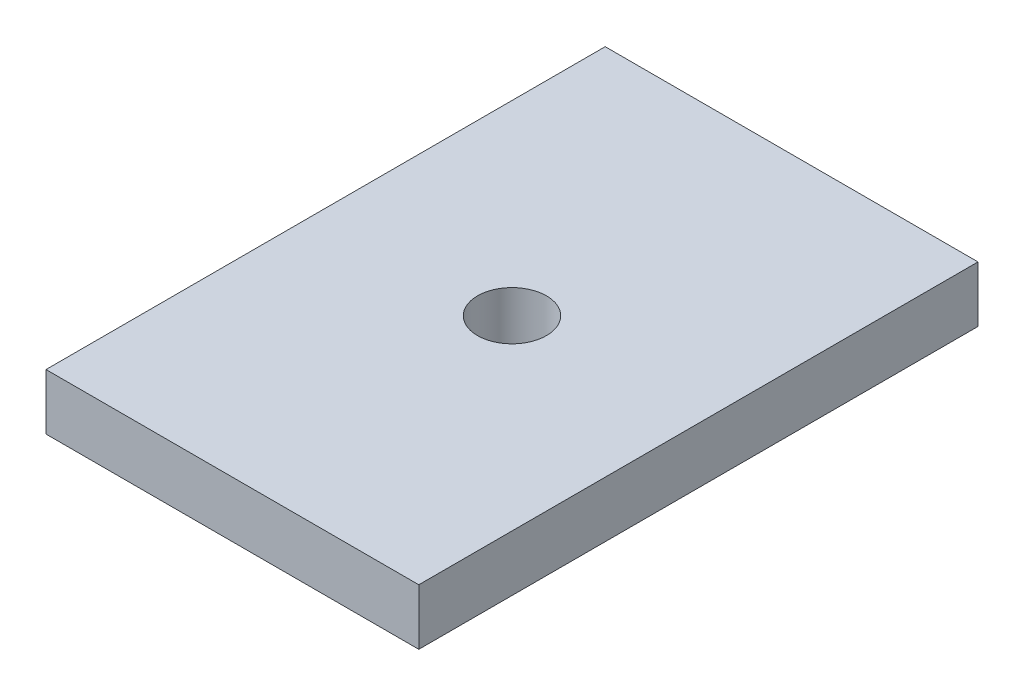
ISO-10303-21;
HEADER;
FILE_DESCRIPTION(('STEP AP214'),'2;1');
FILE_NAME('part.step','',(''),(''),'','','');
FILE_SCHEMA(('AUTOMOTIVE_DESIGN { 1 0 10303 214 1 1 1 1 }'));
ENDSEC;
DATA;
#1=APPLICATION_CONTEXT('core data for automotive mechanical design processes');
#2=APPLICATION_PROTOCOL_DEFINITION('international standard','automotive_design',2000,#1);
#3=PRODUCT_CONTEXT('',#1,'mechanical');
#4=PRODUCT('Part','Part','',(#3));
#5=PRODUCT_RELATED_PRODUCT_CATEGORY('part','',(#4));
#6=PRODUCT_DEFINITION_FORMATION('','',#4);
#7=PRODUCT_DEFINITION_CONTEXT('part definition',#1,'design');
#8=PRODUCT_DEFINITION('design','',#6,#7);
#9=PRODUCT_DEFINITION_SHAPE('','',#8);
#10=(LENGTH_UNIT() NAMED_UNIT(*) SI_UNIT(.MILLI.,.METRE.));
#11=(NAMED_UNIT(*) PLANE_ANGLE_UNIT() SI_UNIT($,.RADIAN.));
#12=(NAMED_UNIT(*) SI_UNIT($,.STERADIAN.) SOLID_ANGLE_UNIT());
#13=UNCERTAINTY_MEASURE_WITH_UNIT(LENGTH_MEASURE(1.E-05),#10,'distance_accuracy_value','');
#14=(GEOMETRIC_REPRESENTATION_CONTEXT(3) GLOBAL_UNCERTAINTY_ASSIGNED_CONTEXT((#13)) GLOBAL_UNIT_ASSIGNED_CONTEXT((#10,
#11,#12)) REPRESENTATION_CONTEXT('',''));
#15=CARTESIAN_POINT('',(0.,0.,0.));
#16=DIRECTION('',(0.,0.,1.));
#17=DIRECTION('',(1.,0.,0.));
#18=AXIS2_PLACEMENT_3D('',#15,#16,#17);
#19=CARTESIAN_POINT('',(-10.,3.,-15.));
#20=DIRECTION('',(1.,0.,0.));
#21=DIRECTION('',(0.,0.,-1.));
#22=AXIS2_PLACEMENT_3D('',#19,#20,#21);
#23=PLANE('',#22);
#24=DIRECTION('',(0.,0.,1.));
#25=VECTOR('',#24,1.);
#26=CARTESIAN_POINT('',(-10.,0.,-15.));
#27=LINE('',#26,#25);
#28=CARTESIAN_POINT('',(-10.,0.,-15.));
#29=VERTEX_POINT('',#28);
#30=CARTESIAN_POINT('',(-10.,0.,15.));
#31=VERTEX_POINT('',#30);
#32=EDGE_CURVE('E111',#29,#31,#27,.T.);
#33=ORIENTED_EDGE('',*,*,#32,.T.);
#34=DIRECTION('',(0.,-1.,0.));
#35=VECTOR('',#34,1.);
#36=CARTESIAN_POINT('',(-10.,3.,15.));
#37=LINE('',#36,#35);
#38=CARTESIAN_POINT('',(-10.,3.,15.));
#39=VERTEX_POINT('',#38);
#40=EDGE_CURVE('E11',#39,#31,#37,.T.);
#41=ORIENTED_EDGE('',*,*,#40,.F.);
#42=DIRECTION('',(0.,0.,1.));
#43=VECTOR('',#42,1.);
#44=CARTESIAN_POINT('',(-10.,3.,-15.));
#45=LINE('',#44,#43);
#46=CARTESIAN_POINT('',(-10.,3.,-15.));
#47=VERTEX_POINT('',#46);
#48=EDGE_CURVE('E93',#47,#39,#45,.T.);
#49=ORIENTED_EDGE('',*,*,#48,.F.);
#50=DIRECTION('',(0.,-1.,0.));
#51=VECTOR('',#50,1.);
#52=CARTESIAN_POINT('',(-10.,3.,-15.));
#53=LINE('',#52,#51);
#54=EDGE_CURVE('E60',#47,#29,#53,.T.);
#55=ORIENTED_EDGE('',*,*,#54,.T.);
#56=EDGE_LOOP('',(#33,#41,#49,#55));
#57=FACE_BOUND('',#56,.T.);
#58=ADVANCED_FACE('F43',(#57),#23,.F.);
#59=CARTESIAN_POINT('',(-10.,3.,15.));
#60=DIRECTION('',(0.,0.,-1.));
#61=DIRECTION('',(-1.,0.,0.));
#62=AXIS2_PLACEMENT_3D('',#59,#60,#61);
#63=PLANE('',#62);
#64=DIRECTION('',(1.,0.,0.));
#65=VECTOR('',#64,1.);
#66=CARTESIAN_POINT('',(-10.,0.,15.));
#67=LINE('',#66,#65);
#68=CARTESIAN_POINT('',(10.,0.,15.));
#69=VERTEX_POINT('',#68);
#70=EDGE_CURVE('E99',#31,#69,#67,.T.);
#71=ORIENTED_EDGE('',*,*,#70,.T.);
#72=DIRECTION('',(0.,-1.,0.));
#73=VECTOR('',#72,1.);
#74=CARTESIAN_POINT('',(10.,3.,15.));
#75=LINE('',#74,#73);
#76=CARTESIAN_POINT('',(10.,3.,15.));
#77=VERTEX_POINT('',#76);
#78=EDGE_CURVE('E52',#77,#69,#75,.T.);
#79=ORIENTED_EDGE('',*,*,#78,.F.);
#80=DIRECTION('',(1.,0.,0.));
#81=VECTOR('',#80,1.);
#82=CARTESIAN_POINT('',(-10.,3.,15.));
#83=LINE('',#82,#81);
#84=EDGE_CURVE('E85',#39,#77,#83,.T.);
#85=ORIENTED_EDGE('',*,*,#84,.F.);
#86=ORIENTED_EDGE('',*,*,#40,.T.);
#87=EDGE_LOOP('',(#71,#79,#85,#86));
#88=FACE_BOUND('',#87,.T.);
#89=ADVANCED_FACE('F98',(#88),#63,.F.);
#90=CARTESIAN_POINT('',(10.,3.,-15.));
#91=DIRECTION('',(1.,0.,0.));
#92=DIRECTION('',(0.,0.,-1.));
#93=AXIS2_PLACEMENT_3D('',#90,#91,#92);
#94=PLANE('',#93);
#95=DIRECTION('',(0.,0.,1.));
#96=VECTOR('',#95,1.);
#97=CARTESIAN_POINT('',(10.,0.,-15.));
#98=LINE('',#97,#96);
#99=CARTESIAN_POINT('',(10.,0.,-15.));
#100=VERTEX_POINT('',#99);
#101=EDGE_CURVE('E117',#100,#69,#98,.T.);
#102=ORIENTED_EDGE('',*,*,#101,.F.);
#103=DIRECTION('',(0.,-1.,0.));
#104=VECTOR('',#103,1.);
#105=CARTESIAN_POINT('',(10.,3.,-15.));
#106=LINE('',#105,#104);
#107=CARTESIAN_POINT('',(10.,3.,-15.));
#108=VERTEX_POINT('',#107);
#109=EDGE_CURVE('E74',#108,#100,#106,.T.);
#110=ORIENTED_EDGE('',*,*,#109,.F.);
#111=DIRECTION('',(0.,0.,1.));
#112=VECTOR('',#111,1.);
#113=CARTESIAN_POINT('',(10.,3.,-15.));
#114=LINE('',#113,#112);
#115=EDGE_CURVE('E92',#108,#77,#114,.T.);
#116=ORIENTED_EDGE('',*,*,#115,.T.);
#117=ORIENTED_EDGE('',*,*,#78,.T.);
#118=EDGE_LOOP('',(#102,#110,#116,#117));
#119=FACE_BOUND('',#118,.T.);
#120=ADVANCED_FACE('F103',(#119),#94,.T.);
#121=CARTESIAN_POINT('',(-10.,3.,-15.));
#122=DIRECTION('',(0.,0.,-1.));
#123=DIRECTION('',(-1.,0.,0.));
#124=AXIS2_PLACEMENT_3D('',#121,#122,#123);
#125=PLANE('',#124);
#126=DIRECTION('',(1.,0.,0.));
#127=VECTOR('',#126,1.);
#128=CARTESIAN_POINT('',(-10.,0.,-15.));
#129=LINE('',#128,#127);
#130=EDGE_CURVE('E120',#29,#100,#129,.T.);
#131=ORIENTED_EDGE('',*,*,#130,.F.);
#132=ORIENTED_EDGE('',*,*,#54,.F.);
#133=DIRECTION('',(1.,0.,0.));
#134=VECTOR('',#133,1.);
#135=CARTESIAN_POINT('',(-10.,3.,-15.));
#136=LINE('',#135,#134);
#137=EDGE_CURVE('E105',#47,#108,#136,.T.);
#138=ORIENTED_EDGE('',*,*,#137,.T.);
#139=ORIENTED_EDGE('',*,*,#109,.T.);
#140=EDGE_LOOP('',(#131,#132,#138,#139));
#141=FACE_BOUND('',#140,.T.);
#142=ADVANCED_FACE('F147',(#141),#125,.T.);
#143=CARTESIAN_POINT('',(0.,3.,0.));
#144=DIRECTION('',(0.,1.,0.));
#145=DIRECTION('',(0.,0.,1.));
#146=AXIS2_PLACEMENT_3D('',#143,#144,#145);
#147=PLANE('',#146);
#148=CARTESIAN_POINT('',(0.,3.,0.));
#149=DIRECTION('',(0.,1.,0.));
#150=DIRECTION('',(0.,0.,1.));
#151=AXIS2_PLACEMENT_3D('',#148,#149,#150);
#152=CIRCLE('',#151,1.85);
#153=CARTESIAN_POINT('',(0.,3.,1.85));
#154=VERTEX_POINT('',#153);
#155=EDGE_CURVE('E130',#154,#154,#152,.T.);
#156=ORIENTED_EDGE('',*,*,#155,.F.);
#157=EDGE_LOOP('',(#156));
#158=FACE_BOUND('',#157,.T.);
#159=ORIENTED_EDGE('',*,*,#48,.T.);
#160=ORIENTED_EDGE('',*,*,#84,.T.);
#161=ORIENTED_EDGE('',*,*,#115,.F.);
#162=ORIENTED_EDGE('',*,*,#137,.F.);
#163=EDGE_LOOP('',(#159,#160,#161,#162));
#164=FACE_BOUND('',#163,.T.);
#165=ADVANCED_FACE('F89',(#158,#164),#147,.T.);
#166=CARTESIAN_POINT('',(0.,0.,0.));
#167=DIRECTION('',(0.,1.,0.));
#168=DIRECTION('',(0.,0.,1.));
#169=AXIS2_PLACEMENT_3D('',#166,#167,#168);
#170=PLANE('',#169);
#171=CARTESIAN_POINT('',(0.,0.,0.));
#172=DIRECTION('',(0.,1.,0.));
#173=DIRECTION('',(0.,0.,1.));
#174=AXIS2_PLACEMENT_3D('',#171,#172,#173);
#175=CIRCLE('',#174,1.85);
#176=CARTESIAN_POINT('',(0.,0.,1.85));
#177=VERTEX_POINT('',#176);
#178=EDGE_CURVE('E114',#177,#177,#175,.T.);
#179=ORIENTED_EDGE('',*,*,#178,.T.);
#180=EDGE_LOOP('',(#179));
#181=FACE_BOUND('',#180,.T.);
#182=ORIENTED_EDGE('',*,*,#32,.F.);
#183=ORIENTED_EDGE('',*,*,#130,.T.);
#184=ORIENTED_EDGE('',*,*,#101,.T.);
#185=ORIENTED_EDGE('',*,*,#70,.F.);
#186=EDGE_LOOP('',(#182,#183,#184,#185));
#187=FACE_BOUND('',#186,.T.);
#188=ADVANCED_FACE('F138',(#181,#187),#170,.F.);
#189=CARTESIAN_POINT('',(0.,0.,0.));
#190=DIRECTION('',(0.,1.,0.));
#191=DIRECTION('',(0.,0.,1.));
#192=AXIS2_PLACEMENT_3D('',#189,#190,#191);
#193=CYLINDRICAL_SURFACE('',#192,1.85);
#194=ORIENTED_EDGE('',*,*,#178,.F.);
#195=EDGE_LOOP('',(#194));
#196=FACE_BOUND('',#195,.T.);
#197=ORIENTED_EDGE('',*,*,#155,.T.);
#198=EDGE_LOOP('',(#197));
#199=FACE_BOUND('',#198,.T.);
#200=ADVANCED_FACE('F140',(#196,#199),#193,.F.);
#201=CLOSED_SHELL('',(#58,#89,#120,#142,#165,#188,#200));
#202=MANIFOLD_SOLID_BREP('B2',#201);
#203=ADVANCED_BREP_SHAPE_REPRESENTATION('',(#18,#202),#14);
#204=SHAPE_DEFINITION_REPRESENTATION(#9,#203);
ENDSEC;
END-ISO-10303-21;
